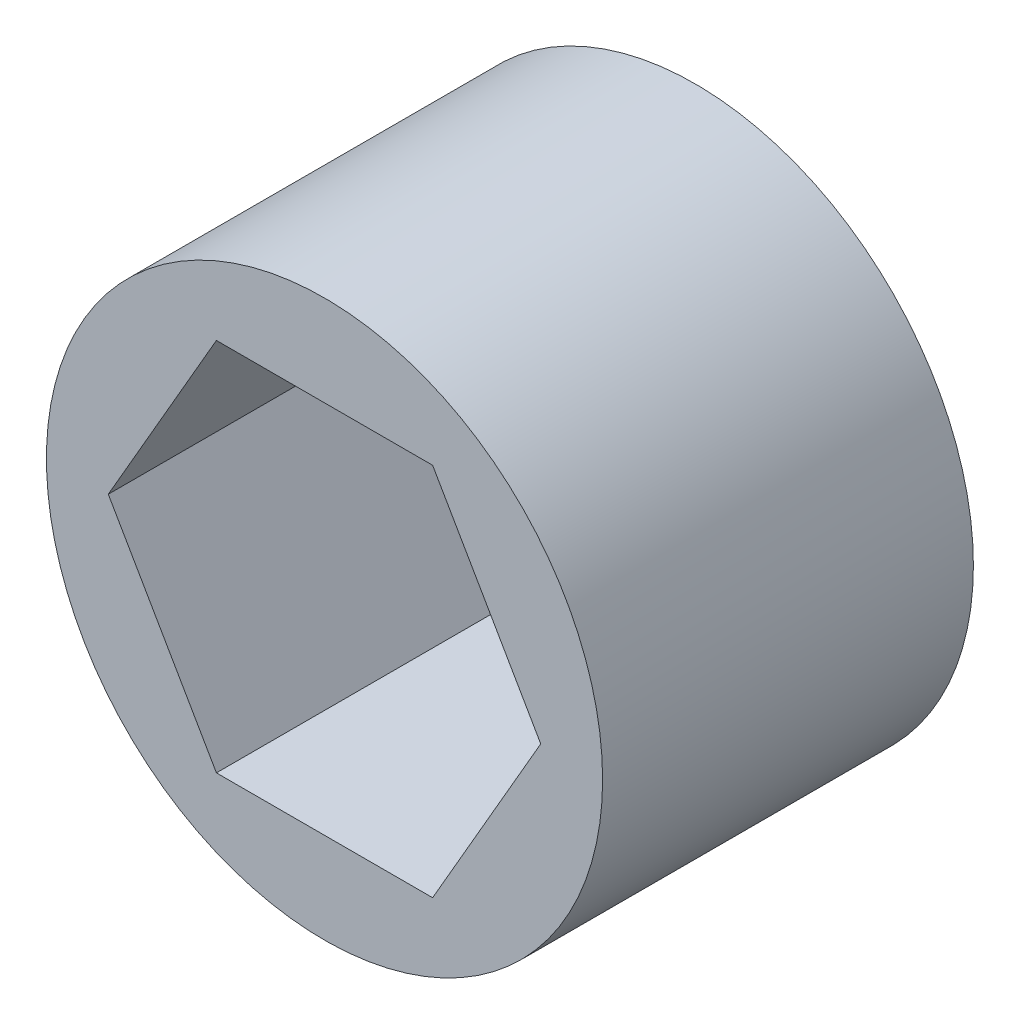
ISO-10303-21;
HEADER;
FILE_DESCRIPTION(('STEP AP214'),'2;1');
FILE_NAME('part.step','',(''),(''),'','','');
FILE_SCHEMA(('AUTOMOTIVE_DESIGN { 1 0 10303 214 1 1 1 1 }'));
ENDSEC;
DATA;
#1=APPLICATION_CONTEXT('core data for automotive mechanical design processes');
#2=APPLICATION_PROTOCOL_DEFINITION('international standard','automotive_design',2000,#1);
#3=PRODUCT_CONTEXT('',#1,'mechanical');
#4=PRODUCT('Part','Part','',(#3));
#5=PRODUCT_RELATED_PRODUCT_CATEGORY('part','',(#4));
#6=PRODUCT_DEFINITION_FORMATION('','',#4);
#7=PRODUCT_DEFINITION_CONTEXT('part definition',#1,'design');
#8=PRODUCT_DEFINITION('design','',#6,#7);
#9=PRODUCT_DEFINITION_SHAPE('','',#8);
#10=(LENGTH_UNIT() NAMED_UNIT(*) SI_UNIT(.MILLI.,.METRE.));
#11=(NAMED_UNIT(*) PLANE_ANGLE_UNIT() SI_UNIT($,.RADIAN.));
#12=(NAMED_UNIT(*) SI_UNIT($,.STERADIAN.) SOLID_ANGLE_UNIT());
#13=UNCERTAINTY_MEASURE_WITH_UNIT(LENGTH_MEASURE(1.E-05),#10,'distance_accuracy_value','');
#14=(GEOMETRIC_REPRESENTATION_CONTEXT(3) GLOBAL_UNCERTAINTY_ASSIGNED_CONTEXT((#13)) GLOBAL_UNIT_ASSIGNED_CONTEXT((#10,
#11,#12)) REPRESENTATION_CONTEXT('',''));
#15=CARTESIAN_POINT('',(0.,0.,0.));
#16=DIRECTION('',(0.,0.,1.));
#17=DIRECTION('',(1.,0.,0.));
#18=AXIS2_PLACEMENT_3D('',#15,#16,#17);
#19=CARTESIAN_POINT('',(0.,0.,12.7));
#20=DIRECTION('',(0.,0.,-1.));
#21=DIRECTION('',(-1.,0.,0.));
#22=AXIS2_PLACEMENT_3D('',#19,#20,#21);
#23=CYLINDRICAL_SURFACE('',#22,9.525);
#24=CARTESIAN_POINT('',(0.,0.,12.7));
#25=DIRECTION('',(0.,0.,1.));
#26=DIRECTION('',(1.,0.,0.));
#27=AXIS2_PLACEMENT_3D('',#24,#25,#26);
#28=CIRCLE('',#27,9.525);
#29=CARTESIAN_POINT('',(9.525,0.,12.7));
#30=VERTEX_POINT('',#29);
#31=EDGE_CURVE('E11',#30,#30,#28,.T.);
#32=ORIENTED_EDGE('',*,*,#31,.F.);
#33=EDGE_LOOP('',(#32));
#34=FACE_BOUND('',#33,.T.);
#35=CARTESIAN_POINT('',(0.,0.,0.));
#36=DIRECTION('',(0.,0.,1.));
#37=DIRECTION('',(1.,0.,0.));
#38=AXIS2_PLACEMENT_3D('',#35,#36,#37);
#39=CIRCLE('',#38,9.525);
#40=CARTESIAN_POINT('',(9.525,0.,0.));
#41=VERTEX_POINT('',#40);
#42=EDGE_CURVE('E20',#41,#41,#39,.T.);
#43=ORIENTED_EDGE('',*,*,#42,.T.);
#44=EDGE_LOOP('',(#43));
#45=FACE_BOUND('',#44,.T.);
#46=ADVANCED_FACE('F17',(#34,#45),#23,.T.);
#47=CARTESIAN_POINT('',(0.,0.,12.7));
#48=DIRECTION('',(0.,0.,1.));
#49=DIRECTION('',(1.,0.,0.));
#50=AXIS2_PLACEMENT_3D('',#47,#48,#49);
#51=PLANE('',#50);
#52=DIRECTION('',(-0.5,0.866025403784439,0.));
#53=VECTOR('',#52,1.);
#54=CARTESIAN_POINT('',(5.5542539271715,3.20675,12.7));
#55=LINE('',#54,#53);
#56=CARTESIAN_POINT('',(7.40567190289533,0.,12.7));
#57=VERTEX_POINT('',#56);
#58=CARTESIAN_POINT('',(3.70283595144766,6.4135,12.7));
#59=VERTEX_POINT('',#58);
#60=EDGE_CURVE('E87',#57,#59,#55,.T.);
#61=ORIENTED_EDGE('',*,*,#60,.F.);
#62=DIRECTION('',(0.5,0.866025403784438,0.));
#63=VECTOR('',#62,1.);
#64=CARTESIAN_POINT('',(5.5542539271715,-3.20675,12.7));
#65=LINE('',#64,#63);
#66=CARTESIAN_POINT('',(3.70283595144766,-6.4135,12.7));
#67=VERTEX_POINT('',#66);
#68=EDGE_CURVE('E112',#67,#57,#65,.T.);
#69=ORIENTED_EDGE('',*,*,#68,.F.);
#70=DIRECTION('',(1.,0.,0.));
#71=VECTOR('',#70,1.);
#72=CARTESIAN_POINT('',(0.,-6.4135,12.7));
#73=LINE('',#72,#71);
#74=CARTESIAN_POINT('',(-3.70283595144766,-6.4135,12.7));
#75=VERTEX_POINT('',#74);
#76=EDGE_CURVE('E32',#75,#67,#73,.T.);
#77=ORIENTED_EDGE('',*,*,#76,.F.);
#78=DIRECTION('',(0.5,-0.866025403784439,0.));
#79=VECTOR('',#78,1.);
#80=CARTESIAN_POINT('',(-5.5542539271715,-3.20675,12.7));
#81=LINE('',#80,#79);
#82=CARTESIAN_POINT('',(-7.40567190289533,0.,12.7));
#83=VERTEX_POINT('',#82);
#84=EDGE_CURVE('E104',#83,#75,#81,.T.);
#85=ORIENTED_EDGE('',*,*,#84,.F.);
#86=DIRECTION('',(-0.5,-0.866025403784439,0.));
#87=VECTOR('',#86,1.);
#88=CARTESIAN_POINT('',(-5.5542539271715,3.20675,12.7));
#89=LINE('',#88,#87);
#90=CARTESIAN_POINT('',(-3.70283595144766,6.4135,12.7));
#91=VERTEX_POINT('',#90);
#92=EDGE_CURVE('E97',#91,#83,#89,.T.);
#93=ORIENTED_EDGE('',*,*,#92,.F.);
#94=DIRECTION('',(-1.,0.,0.));
#95=VECTOR('',#94,1.);
#96=CARTESIAN_POINT('',(0.,6.4135,12.7));
#97=LINE('',#96,#95);
#98=EDGE_CURVE('E76',#59,#91,#97,.T.);
#99=ORIENTED_EDGE('',*,*,#98,.F.);
#100=EDGE_LOOP('',(#61,#69,#77,#85,#93,#99));
#101=FACE_BOUND('',#100,.T.);
#102=ORIENTED_EDGE('',*,*,#31,.T.);
#103=EDGE_LOOP('',(#102));
#104=FACE_BOUND('',#103,.T.);
#105=ADVANCED_FACE('F93',(#101,#104),#51,.T.);
#106=CARTESIAN_POINT('',(0.,0.,0.));
#107=DIRECTION('',(0.,0.,1.));
#108=DIRECTION('',(1.,0.,0.));
#109=AXIS2_PLACEMENT_3D('',#106,#107,#108);
#110=PLANE('',#109);
#111=DIRECTION('',(-0.5,-0.866025403784439,0.));
#112=VECTOR('',#111,1.);
#113=CARTESIAN_POINT('',(5.5542539271715,-3.20675,0.));
#114=LINE('',#113,#112);
#115=CARTESIAN_POINT('',(7.40567190289533,0.,0.));
#116=VERTEX_POINT('',#115);
#117=CARTESIAN_POINT('',(3.70283595144766,-6.4135,0.));
#118=VERTEX_POINT('',#117);
#119=EDGE_CURVE('E127',#116,#118,#114,.T.);
#120=ORIENTED_EDGE('',*,*,#119,.F.);
#121=DIRECTION('',(0.5,-0.866025403784439,0.));
#122=VECTOR('',#121,1.);
#123=CARTESIAN_POINT('',(5.5542539271715,3.20675,0.));
#124=LINE('',#123,#122);
#125=CARTESIAN_POINT('',(3.70283595144766,6.4135,0.));
#126=VERTEX_POINT('',#125);
#127=EDGE_CURVE('E83',#126,#116,#124,.T.);
#128=ORIENTED_EDGE('',*,*,#127,.F.);
#129=DIRECTION('',(1.,0.,0.));
#130=VECTOR('',#129,1.);
#131=CARTESIAN_POINT('',(0.,6.4135,0.));
#132=LINE('',#131,#130);
#133=CARTESIAN_POINT('',(-3.70283595144766,6.4135,0.));
#134=VERTEX_POINT('',#133);
#135=EDGE_CURVE('E79',#134,#126,#132,.T.);
#136=ORIENTED_EDGE('',*,*,#135,.F.);
#137=DIRECTION('',(0.5,0.866025403784439,0.));
#138=VECTOR('',#137,1.);
#139=CARTESIAN_POINT('',(-5.5542539271715,3.20675,0.));
#140=LINE('',#139,#138);
#141=CARTESIAN_POINT('',(-7.40567190289533,0.,0.));
#142=VERTEX_POINT('',#141);
#143=EDGE_CURVE('E135',#142,#134,#140,.T.);
#144=ORIENTED_EDGE('',*,*,#143,.F.);
#145=DIRECTION('',(-0.5,0.866025403784439,0.));
#146=VECTOR('',#145,1.);
#147=CARTESIAN_POINT('',(-5.5542539271715,-3.20675,0.));
#148=LINE('',#147,#146);
#149=CARTESIAN_POINT('',(-3.70283595144766,-6.4135,0.));
#150=VERTEX_POINT('',#149);
#151=EDGE_CURVE('E133',#150,#142,#148,.T.);
#152=ORIENTED_EDGE('',*,*,#151,.F.);
#153=DIRECTION('',(-1.,0.,0.));
#154=VECTOR('',#153,1.);
#155=CARTESIAN_POINT('',(0.,-6.4135,0.));
#156=LINE('',#155,#154);
#157=EDGE_CURVE('E130',#118,#150,#156,.T.);
#158=ORIENTED_EDGE('',*,*,#157,.F.);
#159=EDGE_LOOP('',(#120,#128,#136,#144,#152,#158));
#160=FACE_BOUND('',#159,.T.);
#161=ORIENTED_EDGE('',*,*,#42,.F.);
#162=EDGE_LOOP('',(#161));
#163=FACE_BOUND('',#162,.T.);
#164=ADVANCED_FACE('F144',(#160,#163),#110,.F.);
#165=CARTESIAN_POINT('',(5.5542539271715,3.20675,-0.00200000000000027));
#166=DIRECTION('',(0.866025403784439,0.5,0.));
#167=DIRECTION('',(-0.5,0.866025403784439,0.));
#168=AXIS2_PLACEMENT_3D('',#165,#166,#167);
#169=PLANE('',#168);
#170=ORIENTED_EDGE('',*,*,#127,.T.);
#171=DIRECTION('',(0.,0.,1.));
#172=VECTOR('',#171,1.);
#173=CARTESIAN_POINT('',(7.40567190289533,0.,-0.00200000000000027));
#174=LINE('',#173,#172);
#175=EDGE_CURVE('E40',#116,#57,#174,.T.);
#176=ORIENTED_EDGE('',*,*,#175,.T.);
#177=ORIENTED_EDGE('',*,*,#60,.T.);
#178=DIRECTION('',(0.,0.,1.));
#179=VECTOR('',#178,1.);
#180=CARTESIAN_POINT('',(3.70283595144766,6.4135,-0.00200000000000027));
#181=LINE('',#180,#179);
#182=EDGE_CURVE('E71',#126,#59,#181,.T.);
#183=ORIENTED_EDGE('',*,*,#182,.F.);
#184=EDGE_LOOP('',(#170,#176,#177,#183));
#185=FACE_BOUND('',#184,.T.);
#186=ADVANCED_FACE('F88',(#185),#169,.F.);
#187=CARTESIAN_POINT('',(0.,6.4135,-0.00200000000000027));
#188=DIRECTION('',(0.,1.,0.));
#189=DIRECTION('',(0.,0.,1.));
#190=AXIS2_PLACEMENT_3D('',#187,#188,#189);
#191=PLANE('',#190);
#192=ORIENTED_EDGE('',*,*,#135,.T.);
#193=ORIENTED_EDGE('',*,*,#182,.T.);
#194=ORIENTED_EDGE('',*,*,#98,.T.);
#195=DIRECTION('',(0.,0.,1.));
#196=VECTOR('',#195,1.);
#197=CARTESIAN_POINT('',(-3.70283595144766,6.4135,-0.00200000000000027));
#198=LINE('',#197,#196);
#199=EDGE_CURVE('E84',#134,#91,#198,.T.);
#200=ORIENTED_EDGE('',*,*,#199,.F.);
#201=EDGE_LOOP('',(#192,#193,#194,#200));
#202=FACE_BOUND('',#201,.T.);
#203=ADVANCED_FACE('F73',(#202),#191,.F.);
#204=CARTESIAN_POINT('',(-5.5542539271715,3.20675,-0.00200000000000027));
#205=DIRECTION('',(-0.866025403784439,0.5,0.));
#206=DIRECTION('',(-0.5,-0.866025403784439,0.));
#207=AXIS2_PLACEMENT_3D('',#204,#205,#206);
#208=PLANE('',#207);
#209=ORIENTED_EDGE('',*,*,#143,.T.);
#210=ORIENTED_EDGE('',*,*,#199,.T.);
#211=ORIENTED_EDGE('',*,*,#92,.T.);
#212=DIRECTION('',(0.,0.,1.));
#213=VECTOR('',#212,1.);
#214=CARTESIAN_POINT('',(-7.40567190289533,0.,-0.00200000000000027));
#215=LINE('',#214,#213);
#216=EDGE_CURVE('E122',#142,#83,#215,.T.);
#217=ORIENTED_EDGE('',*,*,#216,.F.);
#218=EDGE_LOOP('',(#209,#210,#211,#217));
#219=FACE_BOUND('',#218,.T.);
#220=ADVANCED_FACE('F155',(#219),#208,.F.);
#221=CARTESIAN_POINT('',(-5.5542539271715,-3.20675,-0.00200000000000027));
#222=DIRECTION('',(-0.866025403784439,-0.5,0.));
#223=DIRECTION('',(0.5,-0.866025403784439,0.));
#224=AXIS2_PLACEMENT_3D('',#221,#222,#223);
#225=PLANE('',#224);
#226=ORIENTED_EDGE('',*,*,#151,.T.);
#227=ORIENTED_EDGE('',*,*,#216,.T.);
#228=ORIENTED_EDGE('',*,*,#84,.T.);
#229=DIRECTION('',(0.,0.,1.));
#230=VECTOR('',#229,1.);
#231=CARTESIAN_POINT('',(-3.70283595144766,-6.4135,-0.00200000000000027));
#232=LINE('',#231,#230);
#233=EDGE_CURVE('E119',#150,#75,#232,.T.);
#234=ORIENTED_EDGE('',*,*,#233,.F.);
#235=EDGE_LOOP('',(#226,#227,#228,#234));
#236=FACE_BOUND('',#235,.T.);
#237=ADVANCED_FACE('F151',(#236),#225,.F.);
#238=CARTESIAN_POINT('',(0.,-6.4135,-0.00200000000000027));
#239=DIRECTION('',(0.,-1.,0.));
#240=DIRECTION('',(1.,0.,0.));
#241=AXIS2_PLACEMENT_3D('',#238,#239,#240);
#242=PLANE('',#241);
#243=ORIENTED_EDGE('',*,*,#157,.T.);
#244=ORIENTED_EDGE('',*,*,#233,.T.);
#245=ORIENTED_EDGE('',*,*,#76,.T.);
#246=DIRECTION('',(0.,0.,1.));
#247=VECTOR('',#246,1.);
#248=CARTESIAN_POINT('',(3.70283595144766,-6.4135,-0.00200000000000027));
#249=LINE('',#248,#247);
#250=EDGE_CURVE('E116',#118,#67,#249,.T.);
#251=ORIENTED_EDGE('',*,*,#250,.F.);
#252=EDGE_LOOP('',(#243,#244,#245,#251));
#253=FACE_BOUND('',#252,.T.);
#254=ADVANCED_FACE('F148',(#253),#242,.F.);
#255=CARTESIAN_POINT('',(5.5542539271715,-3.20675,-0.00200000000000027));
#256=DIRECTION('',(0.866025403784439,-0.5,0.));
#257=DIRECTION('',(0.5,0.866025403784439,0.));
#258=AXIS2_PLACEMENT_3D('',#255,#256,#257);
#259=PLANE('',#258);
#260=ORIENTED_EDGE('',*,*,#119,.T.);
#261=ORIENTED_EDGE('',*,*,#250,.T.);
#262=ORIENTED_EDGE('',*,*,#68,.T.);
#263=ORIENTED_EDGE('',*,*,#175,.F.);
#264=EDGE_LOOP('',(#260,#261,#262,#263));
#265=FACE_BOUND('',#264,.T.);
#266=ADVANCED_FACE('F147',(#265),#259,.F.);
#267=CLOSED_SHELL('',(#46,#105,#164,#186,#203,#220,#237,#254,#266));
#268=MANIFOLD_SOLID_BREP('B1',#267);
#269=ADVANCED_BREP_SHAPE_REPRESENTATION('',(#18,#268),#14);
#270=SHAPE_DEFINITION_REPRESENTATION(#9,#269);
ENDSEC;
END-ISO-10303-21;
